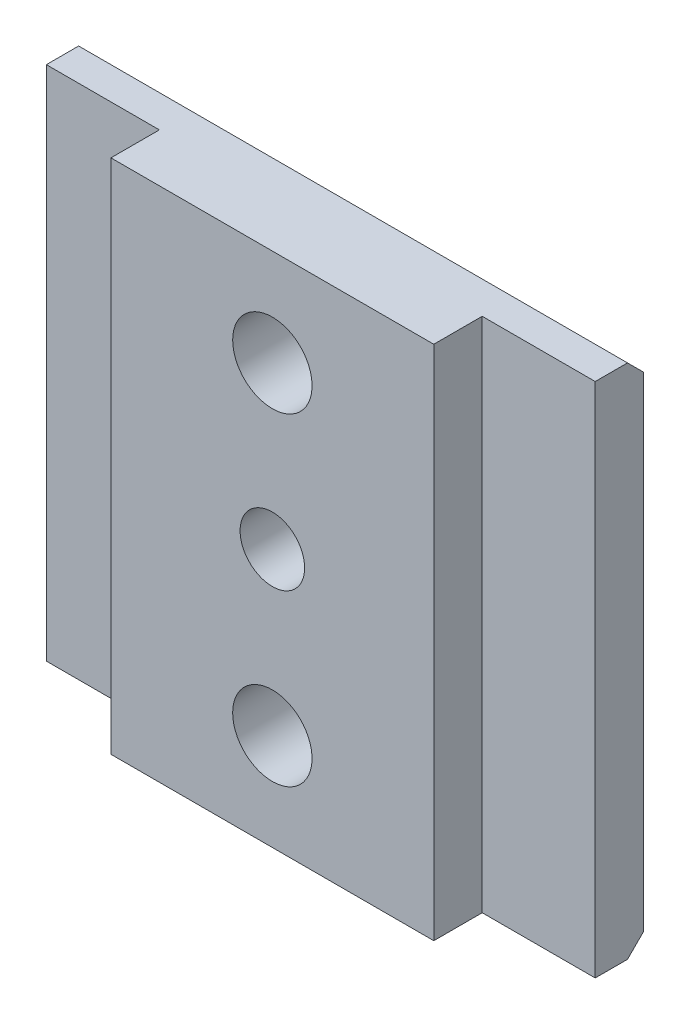
ISO-10303-21;
HEADER;
FILE_DESCRIPTION(('STEP AP214'),'2;1');
FILE_NAME('part.step','',(''),(''),'','','');
FILE_SCHEMA(('AUTOMOTIVE_DESIGN { 1 0 10303 214 1 1 1 1 }'));
ENDSEC;
DATA;
#1=APPLICATION_CONTEXT('core data for automotive mechanical design processes');
#2=APPLICATION_PROTOCOL_DEFINITION('international standard','automotive_design',2000,#1);
#3=PRODUCT_CONTEXT('',#1,'mechanical');
#4=PRODUCT('Part','Part','',(#3));
#5=PRODUCT_RELATED_PRODUCT_CATEGORY('part','',(#4));
#6=PRODUCT_DEFINITION_FORMATION('','',#4);
#7=PRODUCT_DEFINITION_CONTEXT('part definition',#1,'design');
#8=PRODUCT_DEFINITION('design','',#6,#7);
#9=PRODUCT_DEFINITION_SHAPE('','',#8);
#10=(LENGTH_UNIT() NAMED_UNIT(*) SI_UNIT(.MILLI.,.METRE.));
#11=(NAMED_UNIT(*) PLANE_ANGLE_UNIT() SI_UNIT($,.RADIAN.));
#12=(NAMED_UNIT(*) SI_UNIT($,.STERADIAN.) SOLID_ANGLE_UNIT());
#13=UNCERTAINTY_MEASURE_WITH_UNIT(LENGTH_MEASURE(1.E-05),#10,'distance_accuracy_value','');
#14=(GEOMETRIC_REPRESENTATION_CONTEXT(3) GLOBAL_UNCERTAINTY_ASSIGNED_CONTEXT((#13)) GLOBAL_UNIT_ASSIGNED_CONTEXT((#10,
#11,#12)) REPRESENTATION_CONTEXT('',''));
#15=CARTESIAN_POINT('',(0.,0.,0.));
#16=DIRECTION('',(0.,0.,1.));
#17=DIRECTION('',(1.,0.,0.));
#18=AXIS2_PLACEMENT_3D('',#15,#16,#17);
#19=CARTESIAN_POINT('',(5.,0.,-5.));
#20=DIRECTION('',(1.,0.,0.));
#21=DIRECTION('',(0.,0.,-1.));
#22=AXIS2_PLACEMENT_3D('',#19,#20,#21);
#23=PLANE('',#22);
#24=DIRECTION('',(0.,0.,1.));
#25=VECTOR('',#24,1.);
#26=CARTESIAN_POINT('',(5.,8.,0.));
#27=LINE('',#26,#25);
#28=CARTESIAN_POINT('',(5.,8.,-4.25000000000001));
#29=VERTEX_POINT('',#28);
#30=CARTESIAN_POINT('',(5.,8.,-5.75));
#31=VERTEX_POINT('',#30);
#32=EDGE_CURVE('E119',#29,#31,#27,.F.);
#33=ORIENTED_EDGE('',*,*,#32,.F.);
#34=DIRECTION('',(0.,1.,0.));
#35=VECTOR('',#34,1.);
#36=CARTESIAN_POINT('',(5.,-8.,-4.25000000000001));
#37=LINE('',#36,#35);
#38=CARTESIAN_POINT('',(5.,-8.,-4.25000000000001));
#39=VERTEX_POINT('',#38);
#40=EDGE_CURVE('E173',#29,#39,#37,.F.);
#41=ORIENTED_EDGE('',*,*,#40,.T.);
#42=DIRECTION('',(0.,0.,1.));
#43=VECTOR('',#42,1.);
#44=CARTESIAN_POINT('',(5.,-8.,0.));
#45=LINE('',#44,#43);
#46=CARTESIAN_POINT('',(5.,-8.,-5.75));
#47=VERTEX_POINT('',#46);
#48=EDGE_CURVE('E103',#47,#39,#45,.T.);
#49=ORIENTED_EDGE('',*,*,#48,.F.);
#50=DIRECTION('',(0.,-1.,0.));
#51=VECTOR('',#50,1.);
#52=CARTESIAN_POINT('',(5.,-8.,-5.75));
#53=LINE('',#52,#51);
#54=EDGE_CURVE('E181',#31,#47,#53,.T.);
#55=ORIENTED_EDGE('',*,*,#54,.F.);
#56=EDGE_LOOP('',(#33,#41,#49,#55));
#57=FACE_BOUND('',#56,.T.);
#58=ADVANCED_FACE('F17',(#57),#23,.T.);
#59=CARTESIAN_POINT('',(-5.,0.,-5.));
#60=DIRECTION('',(1.,0.,0.));
#61=DIRECTION('',(0.,0.,-1.));
#62=AXIS2_PLACEMENT_3D('',#59,#60,#61);
#63=PLANE('',#62);
#64=DIRECTION('',(0.,1.,0.));
#65=VECTOR('',#64,1.);
#66=CARTESIAN_POINT('',(-5.,-8.,-4.25000000000001));
#67=LINE('',#66,#65);
#68=CARTESIAN_POINT('',(-5.,-8.,-4.25000000000001));
#69=VERTEX_POINT('',#68);
#70=CARTESIAN_POINT('',(-5.,8.,-4.25000000000001));
#71=VERTEX_POINT('',#70);
#72=EDGE_CURVE('E170',#69,#71,#67,.T.);
#73=ORIENTED_EDGE('',*,*,#72,.T.);
#74=DIRECTION('',(0.,0.,1.));
#75=VECTOR('',#74,1.);
#76=CARTESIAN_POINT('',(-5.,8.,0.));
#77=LINE('',#76,#75);
#78=CARTESIAN_POINT('',(-5.,8.,-5.75));
#79=VERTEX_POINT('',#78);
#80=EDGE_CURVE('E100',#79,#71,#77,.T.);
#81=ORIENTED_EDGE('',*,*,#80,.F.);
#82=DIRECTION('',(0.,1.,0.));
#83=VECTOR('',#82,1.);
#84=CARTESIAN_POINT('',(-5.,-8.,-5.75));
#85=LINE('',#84,#83);
#86=CARTESIAN_POINT('',(-5.,-8.,-5.75));
#87=VERTEX_POINT('',#86);
#88=EDGE_CURVE('E92',#79,#87,#85,.F.);
#89=ORIENTED_EDGE('',*,*,#88,.T.);
#90=DIRECTION('',(0.,0.,1.));
#91=VECTOR('',#90,1.);
#92=CARTESIAN_POINT('',(-5.,-8.,0.));
#93=LINE('',#92,#91);
#94=EDGE_CURVE('E98',#69,#87,#93,.F.);
#95=ORIENTED_EDGE('',*,*,#94,.F.);
#96=EDGE_LOOP('',(#73,#81,#89,#95));
#97=FACE_BOUND('',#96,.T.);
#98=ADVANCED_FACE('F97',(#97),#63,.F.);
#99=CARTESIAN_POINT('',(-8.5,-8.,0.));
#100=DIRECTION('',(0.,-1.,0.));
#101=DIRECTION('',(1.,0.,0.));
#102=AXIS2_PLACEMENT_3D('',#99,#100,#101);
#103=PLANE('',#102);
#104=DIRECTION('',(1.,0.,0.));
#105=VECTOR('',#104,1.);
#106=CARTESIAN_POINT('',(8.5,-8.,-5.75));
#107=LINE('',#106,#105);
#108=CARTESIAN_POINT('',(8.5,-8.,-5.75));
#109=VERTEX_POINT('',#108);
#110=EDGE_CURVE('E178',#47,#109,#107,.T.);
#111=ORIENTED_EDGE('',*,*,#110,.F.);
#112=ORIENTED_EDGE('',*,*,#48,.T.);
#113=DIRECTION('',(-1.,0.,0.));
#114=VECTOR('',#113,1.);
#115=CARTESIAN_POINT('',(8.5,-8.,-4.25000000000001));
#116=LINE('',#115,#114);
#117=EDGE_CURVE('E112',#39,#69,#116,.T.);
#118=ORIENTED_EDGE('',*,*,#117,.T.);
#119=ORIENTED_EDGE('',*,*,#94,.T.);
#120=DIRECTION('',(1.,0.,0.));
#121=VECTOR('',#120,1.);
#122=CARTESIAN_POINT('',(-8.5,-8.,-5.75));
#123=LINE('',#122,#121);
#124=CARTESIAN_POINT('',(-8.5,-8.,-5.75));
#125=VERTEX_POINT('',#124);
#126=EDGE_CURVE('E102',#87,#125,#123,.F.);
#127=ORIENTED_EDGE('',*,*,#126,.T.);
#128=DIRECTION('',(0.,0.,1.));
#129=VECTOR('',#128,1.);
#130=CARTESIAN_POINT('',(-8.5,-8.,0.));
#131=LINE('',#130,#129);
#132=CARTESIAN_POINT('',(-8.5,-8.,-6.75));
#133=VERTEX_POINT('',#132);
#134=EDGE_CURVE('E114',#125,#133,#131,.F.);
#135=ORIENTED_EDGE('',*,*,#134,.T.);
#136=DIRECTION('',(1.,0.,0.));
#137=VECTOR('',#136,1.);
#138=CARTESIAN_POINT('',(-4.25,-8.,-6.75));
#139=LINE('',#138,#137);
#140=CARTESIAN_POINT('',(8.5,-8.,-6.75));
#141=VERTEX_POINT('',#140);
#142=EDGE_CURVE('E167',#141,#133,#139,.F.);
#143=ORIENTED_EDGE('',*,*,#142,.F.);
#144=DIRECTION('',(0.,0.,1.));
#145=VECTOR('',#144,1.);
#146=CARTESIAN_POINT('',(8.5,-8.,0.));
#147=LINE('',#146,#145);
#148=EDGE_CURVE('E126',#141,#109,#147,.T.);
#149=ORIENTED_EDGE('',*,*,#148,.T.);
#150=EDGE_LOOP('',(#111,#112,#118,#119,#127,#135,#143,#149));
#151=FACE_BOUND('',#150,.T.);
#152=ADVANCED_FACE('F108',(#151),#103,.T.);
#153=CARTESIAN_POINT('',(-8.5,-8.,-5.75));
#154=DIRECTION('',(0.,0.,-1.));
#155=DIRECTION('',(0.,1.,0.));
#156=AXIS2_PLACEMENT_3D('',#153,#154,#155);
#157=PLANE('',#156);
#158=ORIENTED_EDGE('',*,*,#126,.F.);
#159=ORIENTED_EDGE('',*,*,#88,.F.);
#160=DIRECTION('',(1.,0.,0.));
#161=VECTOR('',#160,1.);
#162=CARTESIAN_POINT('',(8.5,8.,-5.75));
#163=LINE('',#162,#161);
#164=CARTESIAN_POINT('',(-8.5,8.,-5.75));
#165=VERTEX_POINT('',#164);
#166=EDGE_CURVE('E188',#165,#79,#163,.T.);
#167=ORIENTED_EDGE('',*,*,#166,.F.);
#168=DIRECTION('',(0.,1.,0.));
#169=VECTOR('',#168,1.);
#170=CARTESIAN_POINT('',(-8.5,8.,-5.75));
#171=LINE('',#170,#169);
#172=EDGE_CURVE('E118',#125,#165,#171,.T.);
#173=ORIENTED_EDGE('',*,*,#172,.F.);
#174=EDGE_LOOP('',(#158,#159,#167,#173));
#175=FACE_BOUND('',#174,.T.);
#176=ADVANCED_FACE('F116',(#175),#157,.F.);
#177=CARTESIAN_POINT('',(8.5,8.,0.));
#178=DIRECTION('',(0.,1.,0.));
#179=DIRECTION('',(0.,0.,1.));
#180=AXIS2_PLACEMENT_3D('',#177,#178,#179);
#181=PLANE('',#180);
#182=ORIENTED_EDGE('',*,*,#166,.T.);
#183=ORIENTED_EDGE('',*,*,#80,.T.);
#184=DIRECTION('',(-1.,0.,0.));
#185=VECTOR('',#184,1.);
#186=CARTESIAN_POINT('',(8.5,8.,-4.25000000000001));
#187=LINE('',#186,#185);
#188=EDGE_CURVE('E175',#71,#29,#187,.F.);
#189=ORIENTED_EDGE('',*,*,#188,.T.);
#190=ORIENTED_EDGE('',*,*,#32,.T.);
#191=DIRECTION('',(1.,0.,0.));
#192=VECTOR('',#191,1.);
#193=CARTESIAN_POINT('',(8.5,8.,-5.75));
#194=LINE('',#193,#192);
#195=CARTESIAN_POINT('',(8.5,8.,-5.75));
#196=VERTEX_POINT('',#195);
#197=EDGE_CURVE('E184',#196,#31,#194,.F.);
#198=ORIENTED_EDGE('',*,*,#197,.F.);
#199=DIRECTION('',(0.,0.,1.));
#200=VECTOR('',#199,1.);
#201=CARTESIAN_POINT('',(8.5,8.,0.));
#202=LINE('',#201,#200);
#203=CARTESIAN_POINT('',(8.5,8.,-6.75));
#204=VERTEX_POINT('',#203);
#205=EDGE_CURVE('E121',#196,#204,#202,.F.);
#206=ORIENTED_EDGE('',*,*,#205,.T.);
#207=DIRECTION('',(1.,0.,0.));
#208=VECTOR('',#207,1.);
#209=CARTESIAN_POINT('',(4.25,8.,-6.75));
#210=LINE('',#209,#208);
#211=CARTESIAN_POINT('',(-8.5,8.,-6.75));
#212=VERTEX_POINT('',#211);
#213=EDGE_CURVE('E156',#212,#204,#210,.T.);
#214=ORIENTED_EDGE('',*,*,#213,.F.);
#215=DIRECTION('',(0.,0.,1.));
#216=VECTOR('',#215,1.);
#217=CARTESIAN_POINT('',(-8.5,8.,0.));
#218=LINE('',#217,#216);
#219=EDGE_CURVE('E164',#165,#212,#218,.F.);
#220=ORIENTED_EDGE('',*,*,#219,.F.);
#221=EDGE_LOOP('',(#182,#183,#189,#190,#198,#206,#214,#220));
#222=FACE_BOUND('',#221,.T.);
#223=ADVANCED_FACE('F192',(#222),#181,.T.);
#224=CARTESIAN_POINT('',(8.5,-8.,-5.75));
#225=DIRECTION('',(0.,0.,1.));
#226=DIRECTION('',(0.,-1.,0.));
#227=AXIS2_PLACEMENT_3D('',#224,#225,#226);
#228=PLANE('',#227);
#229=ORIENTED_EDGE('',*,*,#54,.T.);
#230=ORIENTED_EDGE('',*,*,#110,.T.);
#231=DIRECTION('',(0.,1.,0.));
#232=VECTOR('',#231,1.);
#233=CARTESIAN_POINT('',(8.5,-8.,-5.75));
#234=LINE('',#233,#232);
#235=EDGE_CURVE('E149',#196,#109,#234,.F.);
#236=ORIENTED_EDGE('',*,*,#235,.F.);
#237=ORIENTED_EDGE('',*,*,#197,.T.);
#238=EDGE_LOOP('',(#229,#230,#236,#237));
#239=FACE_BOUND('',#238,.T.);
#240=ADVANCED_FACE('F212',(#239),#228,.T.);
#241=CARTESIAN_POINT('',(8.5,-8.,-4.25000000000001));
#242=DIRECTION('',(0.,0.,-1.));
#243=DIRECTION('',(-1.,0.,0.));
#244=AXIS2_PLACEMENT_3D('',#241,#242,#243);
#245=PLANE('',#244);
#246=CARTESIAN_POINT('',(0.,-5.,-4.25000000000001));
#247=DIRECTION('',(0.,0.,-1.));
#248=DIRECTION('',(-1.,0.,0.));
#249=AXIS2_PLACEMENT_3D('',#246,#247,#248);
#250=CIRCLE('',#249,1.2295);
#251=CARTESIAN_POINT('',(-1.2295,-5.,-4.25000000000001));
#252=VERTEX_POINT('',#251);
#253=EDGE_CURVE('E20',#252,#252,#250,.T.);
#254=ORIENTED_EDGE('',*,*,#253,.T.);
#255=EDGE_LOOP('',(#254));
#256=FACE_BOUND('',#255,.T.);
#257=CARTESIAN_POINT('',(0.,5.,-4.25000000000001));
#258=DIRECTION('',(0.,0.,-1.));
#259=DIRECTION('',(-1.,0.,0.));
#260=AXIS2_PLACEMENT_3D('',#257,#258,#259);
#261=CIRCLE('',#260,1.2295);
#262=CARTESIAN_POINT('',(-1.2295,5.,-4.25000000000001));
#263=VERTEX_POINT('',#262);
#264=EDGE_CURVE('E138',#263,#263,#261,.T.);
#265=ORIENTED_EDGE('',*,*,#264,.T.);
#266=EDGE_LOOP('',(#265));
#267=FACE_BOUND('',#266,.T.);
#268=CARTESIAN_POINT('',(0.,0.,-4.25));
#269=DIRECTION('',(0.,0.,-1.));
#270=DIRECTION('',(-1.,0.,0.));
#271=AXIS2_PLACEMENT_3D('',#268,#269,#270);
#272=CIRCLE('',#271,1.);
#273=CARTESIAN_POINT('',(-1.,0.,-4.25));
#274=VERTEX_POINT('',#273);
#275=EDGE_CURVE('E135',#274,#274,#272,.T.);
#276=ORIENTED_EDGE('',*,*,#275,.T.);
#277=EDGE_LOOP('',(#276));
#278=FACE_BOUND('',#277,.T.);
#279=ORIENTED_EDGE('',*,*,#117,.F.);
#280=ORIENTED_EDGE('',*,*,#40,.F.);
#281=ORIENTED_EDGE('',*,*,#188,.F.);
#282=ORIENTED_EDGE('',*,*,#72,.F.);
#283=EDGE_LOOP('',(#279,#280,#281,#282));
#284=FACE_BOUND('',#283,.T.);
#285=ADVANCED_FACE('F207',(#256,#267,#278,#284),#245,.F.);
#286=CARTESIAN_POINT('',(-4.25,-7.75,-7.));
#287=DIRECTION('',(0.,-0.707106781186548,-0.707106781186548));
#288=DIRECTION('',(0.,0.707106781186548,-0.707106781186548));
#289=AXIS2_PLACEMENT_3D('',#286,#287,#288);
#290=PLANE('',#289);
#291=DIRECTION('',(0.,0.707106781186547,-0.707106781186547));
#292=VECTOR('',#291,1.);
#293=CARTESIAN_POINT('',(8.5,-8.,-6.75));
#294=LINE('',#293,#292);
#295=CARTESIAN_POINT('',(8.5,-7.5,-7.25));
#296=VERTEX_POINT('',#295);
#297=EDGE_CURVE('E145',#141,#296,#294,.T.);
#298=ORIENTED_EDGE('',*,*,#297,.F.);
#299=ORIENTED_EDGE('',*,*,#142,.T.);
#300=DIRECTION('',(0.,-0.707106781186547,0.707106781186547));
#301=VECTOR('',#300,1.);
#302=CARTESIAN_POINT('',(-8.5,-7.5,-7.25));
#303=LINE('',#302,#301);
#304=CARTESIAN_POINT('',(-8.5,-7.5,-7.25));
#305=VERTEX_POINT('',#304);
#306=EDGE_CURVE('E161',#305,#133,#303,.T.);
#307=ORIENTED_EDGE('',*,*,#306,.F.);
#308=DIRECTION('',(-1.,0.,0.));
#309=VECTOR('',#308,1.);
#310=CARTESIAN_POINT('',(0.,-7.5,-7.25));
#311=LINE('',#310,#309);
#312=EDGE_CURVE('E137',#296,#305,#311,.T.);
#313=ORIENTED_EDGE('',*,*,#312,.F.);
#314=EDGE_LOOP('',(#298,#299,#307,#313));
#315=FACE_BOUND('',#314,.T.);
#316=ADVANCED_FACE('F217',(#315),#290,.T.);
#317=CARTESIAN_POINT('',(-8.5,8.,0.));
#318=DIRECTION('',(-1.,0.,0.));
#319=DIRECTION('',(0.,0.,1.));
#320=AXIS2_PLACEMENT_3D('',#317,#318,#319);
#321=PLANE('',#320);
#322=ORIENTED_EDGE('',*,*,#306,.T.);
#323=ORIENTED_EDGE('',*,*,#134,.F.);
#324=ORIENTED_EDGE('',*,*,#172,.T.);
#325=ORIENTED_EDGE('',*,*,#219,.T.);
#326=DIRECTION('',(0.,0.707106781186548,0.707106781186548));
#327=VECTOR('',#326,1.);
#328=CARTESIAN_POINT('',(-8.50000000000001,7.75,-7.));
#329=LINE('',#328,#327);
#330=CARTESIAN_POINT('',(-8.5,7.5,-7.25));
#331=VERTEX_POINT('',#330);
#332=EDGE_CURVE('E158',#331,#212,#329,.T.);
#333=ORIENTED_EDGE('',*,*,#332,.F.);
#334=DIRECTION('',(0.,1.,0.));
#335=VECTOR('',#334,1.);
#336=CARTESIAN_POINT('',(-8.5,0.,-7.25));
#337=LINE('',#336,#335);
#338=EDGE_CURVE('E202',#305,#331,#337,.T.);
#339=ORIENTED_EDGE('',*,*,#338,.F.);
#340=EDGE_LOOP('',(#322,#323,#324,#325,#333,#339));
#341=FACE_BOUND('',#340,.T.);
#342=ADVANCED_FACE('F201',(#341),#321,.T.);
#343=CARTESIAN_POINT('',(4.25,7.75,-7.));
#344=DIRECTION('',(0.,0.707106781186548,-0.707106781186548));
#345=DIRECTION('',(0.,0.707106781186548,0.707106781186548));
#346=AXIS2_PLACEMENT_3D('',#343,#344,#345);
#347=PLANE('',#346);
#348=ORIENTED_EDGE('',*,*,#332,.T.);
#349=ORIENTED_EDGE('',*,*,#213,.T.);
#350=DIRECTION('',(0.,0.707106781186547,0.707106781186547));
#351=VECTOR('',#350,1.);
#352=CARTESIAN_POINT('',(8.5,7.5,-7.25));
#353=LINE('',#352,#351);
#354=CARTESIAN_POINT('',(8.5,7.5,-7.25));
#355=VERTEX_POINT('',#354);
#356=EDGE_CURVE('E35',#355,#204,#353,.T.);
#357=ORIENTED_EDGE('',*,*,#356,.F.);
#358=DIRECTION('',(-1.,0.,0.));
#359=VECTOR('',#358,1.);
#360=CARTESIAN_POINT('',(0.,7.5,-7.25));
#361=LINE('',#360,#359);
#362=EDGE_CURVE('E197',#331,#355,#361,.F.);
#363=ORIENTED_EDGE('',*,*,#362,.F.);
#364=EDGE_LOOP('',(#348,#349,#357,#363));
#365=FACE_BOUND('',#364,.T.);
#366=ADVANCED_FACE('F195',(#365),#347,.T.);
#367=CARTESIAN_POINT('',(8.5,-8.,0.));
#368=DIRECTION('',(1.,0.,0.));
#369=DIRECTION('',(0.,1.,0.));
#370=AXIS2_PLACEMENT_3D('',#367,#368,#369);
#371=PLANE('',#370);
#372=ORIENTED_EDGE('',*,*,#356,.T.);
#373=ORIENTED_EDGE('',*,*,#205,.F.);
#374=ORIENTED_EDGE('',*,*,#235,.T.);
#375=ORIENTED_EDGE('',*,*,#148,.F.);
#376=ORIENTED_EDGE('',*,*,#297,.T.);
#377=DIRECTION('',(0.,1.,0.));
#378=VECTOR('',#377,1.);
#379=CARTESIAN_POINT('',(8.5,0.,-7.25));
#380=LINE('',#379,#378);
#381=EDGE_CURVE('E134',#355,#296,#380,.F.);
#382=ORIENTED_EDGE('',*,*,#381,.F.);
#383=EDGE_LOOP('',(#372,#373,#374,#375,#376,#382));
#384=FACE_BOUND('',#383,.T.);
#385=ADVANCED_FACE('F213',(#384),#371,.T.);
#386=CARTESIAN_POINT('',(0.,-5.,-4.75));
#387=DIRECTION('',(0.,0.,-1.));
#388=DIRECTION('',(-1.,0.,0.));
#389=AXIS2_PLACEMENT_3D('',#386,#387,#388);
#390=CYLINDRICAL_SURFACE('',#389,1.2295);
#391=CARTESIAN_POINT('',(0.,-5.,-7.25));
#392=DIRECTION('',(0.,0.,-1.));
#393=DIRECTION('',(-1.,0.,0.));
#394=AXIS2_PLACEMENT_3D('',#391,#392,#393);
#395=CIRCLE('',#394,1.2295);
#396=CARTESIAN_POINT('',(-1.2295,-5.,-7.25));
#397=VERTEX_POINT('',#396);
#398=EDGE_CURVE('E131',#397,#397,#395,.F.);
#399=ORIENTED_EDGE('',*,*,#398,.F.);
#400=EDGE_LOOP('',(#399));
#401=FACE_BOUND('',#400,.T.);
#402=ORIENTED_EDGE('',*,*,#253,.F.);
#403=EDGE_LOOP('',(#402));
#404=FACE_BOUND('',#403,.T.);
#405=ADVANCED_FACE('F237',(#401,#404),#390,.F.);
#406=CARTESIAN_POINT('',(0.,5.,-4.75));
#407=DIRECTION('',(0.,0.,-1.));
#408=DIRECTION('',(-1.,0.,0.));
#409=AXIS2_PLACEMENT_3D('',#406,#407,#408);
#410=CYLINDRICAL_SURFACE('',#409,1.2295);
#411=CARTESIAN_POINT('',(0.,5.,-7.25));
#412=DIRECTION('',(0.,0.,-1.));
#413=DIRECTION('',(-1.,0.,0.));
#414=AXIS2_PLACEMENT_3D('',#411,#412,#413);
#415=CIRCLE('',#414,1.2295);
#416=CARTESIAN_POINT('',(-1.2295,5.,-7.25));
#417=VERTEX_POINT('',#416);
#418=EDGE_CURVE('E26',#417,#417,#415,.F.);
#419=ORIENTED_EDGE('',*,*,#418,.F.);
#420=EDGE_LOOP('',(#419));
#421=FACE_BOUND('',#420,.T.);
#422=ORIENTED_EDGE('',*,*,#264,.F.);
#423=EDGE_LOOP('',(#422));
#424=FACE_BOUND('',#423,.T.);
#425=ADVANCED_FACE('F230',(#421,#424),#410,.F.);
#426=CARTESIAN_POINT('',(0.,0.,-5.75));
#427=DIRECTION('',(0.,0.,-1.));
#428=DIRECTION('',(-1.,0.,0.));
#429=AXIS2_PLACEMENT_3D('',#426,#427,#428);
#430=CYLINDRICAL_SURFACE('',#429,1.);
#431=ORIENTED_EDGE('',*,*,#275,.F.);
#432=EDGE_LOOP('',(#431));
#433=FACE_BOUND('',#432,.T.);
#434=CARTESIAN_POINT('',(0.,0.,-7.25));
#435=DIRECTION('',(0.,0.,-1.));
#436=DIRECTION('',(-1.,0.,0.));
#437=AXIS2_PLACEMENT_3D('',#434,#435,#436);
#438=CIRCLE('',#437,1.);
#439=CARTESIAN_POINT('',(-1.,0.,-7.25));
#440=VERTEX_POINT('',#439);
#441=EDGE_CURVE('E11',#440,#440,#438,.F.);
#442=ORIENTED_EDGE('',*,*,#441,.F.);
#443=EDGE_LOOP('',(#442));
#444=FACE_BOUND('',#443,.T.);
#445=ADVANCED_FACE('F223',(#433,#444),#430,.F.);
#446=CARTESIAN_POINT('',(0.,0.,-7.25));
#447=DIRECTION('',(0.,0.,-1.));
#448=DIRECTION('',(-1.,0.,0.));
#449=AXIS2_PLACEMENT_3D('',#446,#447,#448);
#450=PLANE('',#449);
#451=ORIENTED_EDGE('',*,*,#441,.T.);
#452=EDGE_LOOP('',(#451));
#453=FACE_BOUND('',#452,.T.);
#454=ORIENTED_EDGE('',*,*,#418,.T.);
#455=EDGE_LOOP('',(#454));
#456=FACE_BOUND('',#455,.T.);
#457=ORIENTED_EDGE('',*,*,#398,.T.);
#458=EDGE_LOOP('',(#457));
#459=FACE_BOUND('',#458,.T.);
#460=ORIENTED_EDGE('',*,*,#362,.T.);
#461=ORIENTED_EDGE('',*,*,#381,.T.);
#462=ORIENTED_EDGE('',*,*,#312,.T.);
#463=ORIENTED_EDGE('',*,*,#338,.T.);
#464=EDGE_LOOP('',(#460,#461,#462,#463));
#465=FACE_BOUND('',#464,.T.);
#466=ADVANCED_FACE('F221',(#453,#456,#459,#465),#450,.T.);
#467=CLOSED_SHELL('',(#58,#98,#152,#176,#223,#240,#285,#316,#342,#366,#385,#405,#425,#445,#466));
#468=MANIFOLD_SOLID_BREP('B1',#467);
#469=ADVANCED_BREP_SHAPE_REPRESENTATION('',(#18,#468),#14);
#470=SHAPE_DEFINITION_REPRESENTATION(#9,#469);
ENDSEC;
END-ISO-10303-21;
